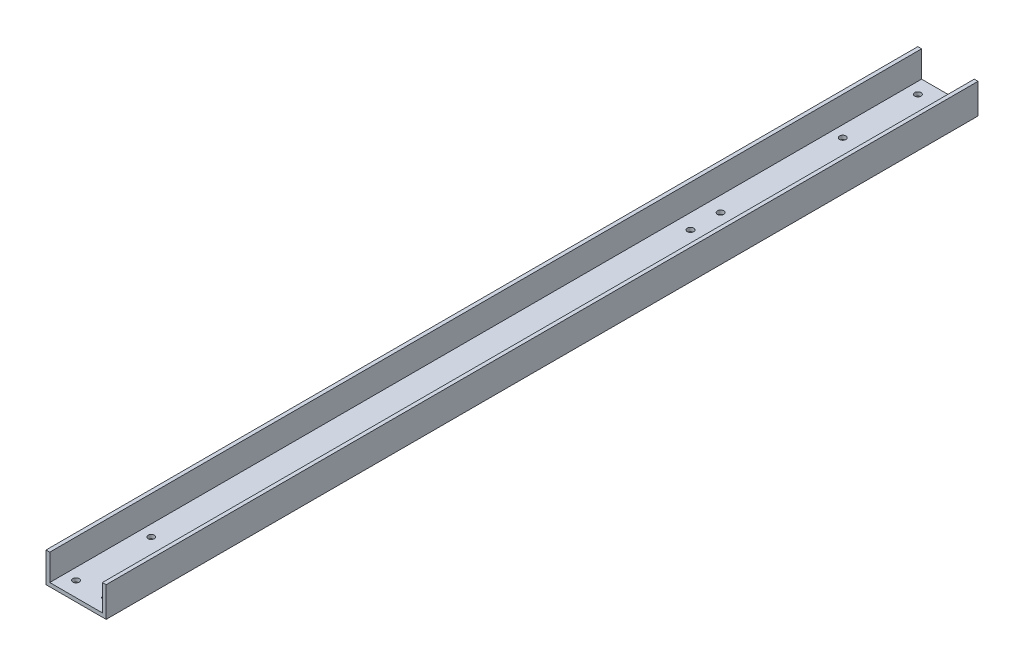
ISO-10303-21;
HEADER;
FILE_DESCRIPTION(('STEP AP214'),'2;1');
FILE_NAME('part.step','',(''),(''),'','','');
FILE_SCHEMA(('AUTOMOTIVE_DESIGN { 1 0 10303 214 1 1 1 1 }'));
ENDSEC;
DATA;
#1=APPLICATION_CONTEXT('core data for automotive mechanical design processes');
#2=APPLICATION_PROTOCOL_DEFINITION('international standard','automotive_design',2000,#1);
#3=PRODUCT_CONTEXT('',#1,'mechanical');
#4=PRODUCT('Part','Part','',(#3));
#5=PRODUCT_RELATED_PRODUCT_CATEGORY('part','',(#4));
#6=PRODUCT_DEFINITION_FORMATION('','',#4);
#7=PRODUCT_DEFINITION_CONTEXT('part definition',#1,'design');
#8=PRODUCT_DEFINITION('design','',#6,#7);
#9=PRODUCT_DEFINITION_SHAPE('','',#8);
#10=(LENGTH_UNIT() NAMED_UNIT(*) SI_UNIT(.MILLI.,.METRE.));
#11=(NAMED_UNIT(*) PLANE_ANGLE_UNIT() SI_UNIT($,.RADIAN.));
#12=(NAMED_UNIT(*) SI_UNIT($,.STERADIAN.) SOLID_ANGLE_UNIT());
#13=UNCERTAINTY_MEASURE_WITH_UNIT(LENGTH_MEASURE(1.E-05),#10,'distance_accuracy_value','');
#14=(GEOMETRIC_REPRESENTATION_CONTEXT(3) GLOBAL_UNCERTAINTY_ASSIGNED_CONTEXT((#13)) GLOBAL_UNIT_ASSIGNED_CONTEXT((#10,
#11,#12)) REPRESENTATION_CONTEXT('',''));
#15=CARTESIAN_POINT('',(0.,0.,0.));
#16=DIRECTION('',(0.,0.,1.));
#17=DIRECTION('',(1.,0.,0.));
#18=AXIS2_PLACEMENT_3D('',#15,#16,#17);
#19=CARTESIAN_POINT('',(0.,0.,736.6));
#20=DIRECTION('',(1.,0.,0.));
#21=DIRECTION('',(0.,0.,-1.));
#22=AXIS2_PLACEMENT_3D('',#19,#20,#21);
#23=PLANE('',#22);
#24=DIRECTION('',(0.,-1.,0.));
#25=VECTOR('',#24,1.);
#26=CARTESIAN_POINT('',(0.,0.,0.));
#27=LINE('',#26,#25);
#28=CARTESIAN_POINT('',(0.,25.4,0.));
#29=VERTEX_POINT('',#28);
#30=CARTESIAN_POINT('',(0.,0.,0.));
#31=VERTEX_POINT('',#30);
#32=EDGE_CURVE('E136',#29,#31,#27,.T.);
#33=ORIENTED_EDGE('',*,*,#32,.T.);
#34=DIRECTION('',(0.,0.,-1.));
#35=VECTOR('',#34,1.);
#36=CARTESIAN_POINT('',(0.,0.,736.6));
#37=LINE('',#36,#35);
#38=CARTESIAN_POINT('',(0.,0.,736.6));
#39=VERTEX_POINT('',#38);
#40=EDGE_CURVE('E11',#39,#31,#37,.T.);
#41=ORIENTED_EDGE('',*,*,#40,.F.);
#42=DIRECTION('',(0.,-1.,0.));
#43=VECTOR('',#42,1.);
#44=CARTESIAN_POINT('',(0.,0.,736.6));
#45=LINE('',#44,#43);
#46=CARTESIAN_POINT('',(0.,25.4,736.6));
#47=VERTEX_POINT('',#46);
#48=EDGE_CURVE('E151',#47,#39,#45,.T.);
#49=ORIENTED_EDGE('',*,*,#48,.F.);
#50=DIRECTION('',(0.,0.,-1.));
#51=VECTOR('',#50,1.);
#52=CARTESIAN_POINT('',(0.,25.4,736.6));
#53=LINE('',#52,#51);
#54=EDGE_CURVE('E132',#47,#29,#53,.T.);
#55=ORIENTED_EDGE('',*,*,#54,.T.);
#56=EDGE_LOOP('',(#33,#41,#49,#55));
#57=FACE_BOUND('',#56,.T.);
#58=ADVANCED_FACE('F38',(#57),#23,.F.);
#59=CARTESIAN_POINT('',(0.,0.,736.6));
#60=DIRECTION('',(0.,1.,0.));
#61=DIRECTION('',(0.,0.,1.));
#62=AXIS2_PLACEMENT_3D('',#59,#60,#61);
#63=PLANE('',#62);
#64=CARTESIAN_POINT('',(15.8750000000001,0.,207.937100000006));
#65=DIRECTION('',(0.,1.,0.));
#66=DIRECTION('',(0.,0.,1.));
#67=AXIS2_PLACEMENT_3D('',#64,#65,#66);
#68=CIRCLE('',#67,2.667);
#69=CARTESIAN_POINT('',(15.8750000000001,0.,210.604100000006));
#70=VERTEX_POINT('',#69);
#71=EDGE_CURVE('E241',#70,#70,#68,.F.);
#72=ORIENTED_EDGE('',*,*,#71,.F.);
#73=EDGE_LOOP('',(#72));
#74=FACE_BOUND('',#73,.T.);
#75=CARTESIAN_POINT('',(34.9250000000001,0.,182.537100000006));
#76=DIRECTION('',(0.,1.,0.));
#77=DIRECTION('',(0.,0.,1.));
#78=AXIS2_PLACEMENT_3D('',#75,#76,#77);
#79=CIRCLE('',#78,2.667);
#80=CARTESIAN_POINT('',(34.9250000000001,0.,185.204100000006));
#81=VERTEX_POINT('',#80);
#82=EDGE_CURVE('E251',#81,#81,#79,.F.);
#83=ORIENTED_EDGE('',*,*,#82,.F.);
#84=EDGE_LOOP('',(#83));
#85=FACE_BOUND('',#84,.T.);
#86=CARTESIAN_POINT('',(15.8750000000001,0.,182.537100000006));
#87=DIRECTION('',(0.,1.,0.));
#88=DIRECTION('',(0.,0.,1.));
#89=AXIS2_PLACEMENT_3D('',#86,#87,#88);
#90=CIRCLE('',#89,2.667);
#91=CARTESIAN_POINT('',(15.8750000000001,0.,185.204100000006));
#92=VERTEX_POINT('',#91);
#93=EDGE_CURVE('E242',#92,#92,#90,.F.);
#94=ORIENTED_EDGE('',*,*,#93,.F.);
#95=EDGE_LOOP('',(#94));
#96=FACE_BOUND('',#95,.T.);
#97=CARTESIAN_POINT('',(34.9250000000001,0.,207.937100000006));
#98=DIRECTION('',(0.,1.,0.));
#99=DIRECTION('',(0.,0.,1.));
#100=AXIS2_PLACEMENT_3D('',#97,#98,#99);
#101=CIRCLE('',#100,2.667);
#102=CARTESIAN_POINT('',(34.9250000000001,0.,210.604100000006));
#103=VERTEX_POINT('',#102);
#104=EDGE_CURVE('E201',#103,#103,#101,.F.);
#105=ORIENTED_EDGE('',*,*,#104,.F.);
#106=EDGE_LOOP('',(#105));
#107=FACE_BOUND('',#106,.T.);
#108=CARTESIAN_POINT('',(12.7,0.,660.4));
#109=DIRECTION('',(0.,1.,0.));
#110=DIRECTION('',(0.,0.,1.));
#111=AXIS2_PLACEMENT_3D('',#108,#109,#110);
#112=CIRCLE('',#111,2.667);
#113=CARTESIAN_POINT('',(12.7,0.,663.067));
#114=VERTEX_POINT('',#113);
#115=EDGE_CURVE('E193',#114,#114,#112,.F.);
#116=ORIENTED_EDGE('',*,*,#115,.F.);
#117=EDGE_LOOP('',(#116));
#118=FACE_BOUND('',#117,.T.);
#119=CARTESIAN_POINT('',(38.1,0.,660.4));
#120=DIRECTION('',(0.,1.,0.));
#121=DIRECTION('',(0.,0.,1.));
#122=AXIS2_PLACEMENT_3D('',#119,#120,#121);
#123=CIRCLE('',#122,2.667);
#124=CARTESIAN_POINT('',(38.1,0.,663.067));
#125=VERTEX_POINT('',#124);
#126=EDGE_CURVE('E226',#125,#125,#123,.F.);
#127=ORIENTED_EDGE('',*,*,#126,.F.);
#128=EDGE_LOOP('',(#127));
#129=FACE_BOUND('',#128,.T.);
#130=CARTESIAN_POINT('',(38.1,0.,723.9));
#131=DIRECTION('',(0.,1.,0.));
#132=DIRECTION('',(0.,0.,1.));
#133=AXIS2_PLACEMENT_3D('',#130,#131,#132);
#134=CIRCLE('',#133,2.667);
#135=CARTESIAN_POINT('',(38.1,0.,726.567));
#136=VERTEX_POINT('',#135);
#137=EDGE_CURVE('E220',#136,#136,#134,.F.);
#138=ORIENTED_EDGE('',*,*,#137,.F.);
#139=EDGE_LOOP('',(#138));
#140=FACE_BOUND('',#139,.T.);
#141=CARTESIAN_POINT('',(38.1,0.,12.7));
#142=DIRECTION('',(0.,1.,0.));
#143=DIRECTION('',(0.,0.,1.));
#144=AXIS2_PLACEMENT_3D('',#141,#142,#143);
#145=CIRCLE('',#144,2.667);
#146=CARTESIAN_POINT('',(38.1,0.,15.367));
#147=VERTEX_POINT('',#146);
#148=EDGE_CURVE('E214',#147,#147,#145,.F.);
#149=ORIENTED_EDGE('',*,*,#148,.F.);
#150=EDGE_LOOP('',(#149));
#151=FACE_BOUND('',#150,.T.);
#152=CARTESIAN_POINT('',(38.1,0.,76.2));
#153=DIRECTION('',(0.,1.,0.));
#154=DIRECTION('',(0.,0.,1.));
#155=AXIS2_PLACEMENT_3D('',#152,#153,#154);
#156=CIRCLE('',#155,2.667);
#157=CARTESIAN_POINT('',(38.1,0.,78.867));
#158=VERTEX_POINT('',#157);
#159=EDGE_CURVE('E208',#158,#158,#156,.F.);
#160=ORIENTED_EDGE('',*,*,#159,.F.);
#161=EDGE_LOOP('',(#160));
#162=FACE_BOUND('',#161,.T.);
#163=CARTESIAN_POINT('',(12.7,0.,12.7));
#164=DIRECTION('',(0.,1.,0.));
#165=DIRECTION('',(0.,0.,1.));
#166=AXIS2_PLACEMENT_3D('',#163,#164,#165);
#167=CIRCLE('',#166,2.667);
#168=CARTESIAN_POINT('',(12.7,0.,15.367));
#169=VERTEX_POINT('',#168);
#170=EDGE_CURVE('E202',#169,#169,#167,.F.);
#171=ORIENTED_EDGE('',*,*,#170,.F.);
#172=EDGE_LOOP('',(#171));
#173=FACE_BOUND('',#172,.T.);
#174=CARTESIAN_POINT('',(12.7,0.,76.2));
#175=DIRECTION('',(0.,1.,0.));
#176=DIRECTION('',(0.,0.,1.));
#177=AXIS2_PLACEMENT_3D('',#174,#175,#176);
#178=CIRCLE('',#177,2.667);
#179=CARTESIAN_POINT('',(12.7,0.,78.867));
#180=VERTEX_POINT('',#179);
#181=EDGE_CURVE('E194',#180,#180,#178,.F.);
#182=ORIENTED_EDGE('',*,*,#181,.F.);
#183=EDGE_LOOP('',(#182));
#184=FACE_BOUND('',#183,.T.);
#185=CARTESIAN_POINT('',(12.7,0.,723.9));
#186=DIRECTION('',(0.,1.,0.));
#187=DIRECTION('',(0.,0.,1.));
#188=AXIS2_PLACEMENT_3D('',#185,#186,#187);
#189=CIRCLE('',#188,2.667);
#190=CARTESIAN_POINT('',(12.7,0.,726.567));
#191=VERTEX_POINT('',#190);
#192=EDGE_CURVE('E140',#191,#191,#189,.F.);
#193=ORIENTED_EDGE('',*,*,#192,.F.);
#194=EDGE_LOOP('',(#193));
#195=FACE_BOUND('',#194,.T.);
#196=DIRECTION('',(1.,0.,0.));
#197=VECTOR('',#196,1.);
#198=CARTESIAN_POINT('',(0.,0.,0.));
#199=LINE('',#198,#197);
#200=CARTESIAN_POINT('',(50.8,0.,0.));
#201=VERTEX_POINT('',#200);
#202=EDGE_CURVE('E139',#31,#201,#199,.T.);
#203=ORIENTED_EDGE('',*,*,#202,.T.);
#204=DIRECTION('',(0.,0.,-1.));
#205=VECTOR('',#204,1.);
#206=CARTESIAN_POINT('',(50.8,0.,736.6));
#207=LINE('',#206,#205);
#208=CARTESIAN_POINT('',(50.8,0.,736.6));
#209=VERTEX_POINT('',#208);
#210=EDGE_CURVE('E47',#209,#201,#207,.T.);
#211=ORIENTED_EDGE('',*,*,#210,.F.);
#212=DIRECTION('',(1.,0.,0.));
#213=VECTOR('',#212,1.);
#214=CARTESIAN_POINT('',(0.,0.,736.6));
#215=LINE('',#214,#213);
#216=EDGE_CURVE('E98',#39,#209,#215,.T.);
#217=ORIENTED_EDGE('',*,*,#216,.F.);
#218=ORIENTED_EDGE('',*,*,#40,.T.);
#219=EDGE_LOOP('',(#203,#211,#217,#218));
#220=FACE_BOUND('',#219,.T.);
#221=ADVANCED_FACE('F299',(#74,#85,#96,#107,#118,#129,#140,#151,#162,#173,#184,#195,#220),#63,.F.);
#222=CARTESIAN_POINT('',(50.8,0.,736.6));
#223=DIRECTION('',(-1.,0.,0.));
#224=DIRECTION('',(0.,0.,1.));
#225=AXIS2_PLACEMENT_3D('',#222,#223,#224);
#226=PLANE('',#225);
#227=DIRECTION('',(0.,1.,0.));
#228=VECTOR('',#227,1.);
#229=CARTESIAN_POINT('',(50.8,0.,0.));
#230=LINE('',#229,#228);
#231=CARTESIAN_POINT('',(50.8,25.4,0.));
#232=VERTEX_POINT('',#231);
#233=EDGE_CURVE('E142',#201,#232,#230,.T.);
#234=ORIENTED_EDGE('',*,*,#233,.T.);
#235=DIRECTION('',(0.,0.,-1.));
#236=VECTOR('',#235,1.);
#237=CARTESIAN_POINT('',(50.8,25.4,736.6));
#238=LINE('',#237,#236);
#239=CARTESIAN_POINT('',(50.8,25.4,736.6));
#240=VERTEX_POINT('',#239);
#241=EDGE_CURVE('E161',#240,#232,#238,.T.);
#242=ORIENTED_EDGE('',*,*,#241,.F.);
#243=DIRECTION('',(0.,1.,0.));
#244=VECTOR('',#243,1.);
#245=CARTESIAN_POINT('',(50.8,0.,736.6));
#246=LINE('',#245,#244);
#247=EDGE_CURVE('E170',#209,#240,#246,.T.);
#248=ORIENTED_EDGE('',*,*,#247,.F.);
#249=ORIENTED_EDGE('',*,*,#210,.T.);
#250=EDGE_LOOP('',(#234,#242,#248,#249));
#251=FACE_BOUND('',#250,.T.);
#252=ADVANCED_FACE('F168',(#251),#226,.F.);
#253=CARTESIAN_POINT('',(47.625,25.4,736.6));
#254=DIRECTION('',(0.,-1.,0.));
#255=DIRECTION('',(0.,0.,-1.));
#256=AXIS2_PLACEMENT_3D('',#253,#254,#255);
#257=PLANE('',#256);
#258=DIRECTION('',(-1.,0.,0.));
#259=VECTOR('',#258,1.);
#260=CARTESIAN_POINT('',(47.625,25.4,0.));
#261=LINE('',#260,#259);
#262=CARTESIAN_POINT('',(47.625,25.4,0.));
#263=VERTEX_POINT('',#262);
#264=EDGE_CURVE('E144',#232,#263,#261,.T.);
#265=ORIENTED_EDGE('',*,*,#264,.T.);
#266=DIRECTION('',(0.,0.,-1.));
#267=VECTOR('',#266,1.);
#268=CARTESIAN_POINT('',(47.625,25.4,736.6));
#269=LINE('',#268,#267);
#270=CARTESIAN_POINT('',(47.625,25.4,736.6));
#271=VERTEX_POINT('',#270);
#272=EDGE_CURVE('E157',#271,#263,#269,.T.);
#273=ORIENTED_EDGE('',*,*,#272,.F.);
#274=DIRECTION('',(-1.,0.,0.));
#275=VECTOR('',#274,1.);
#276=CARTESIAN_POINT('',(47.625,25.4,736.6));
#277=LINE('',#276,#275);
#278=EDGE_CURVE('E182',#240,#271,#277,.T.);
#279=ORIENTED_EDGE('',*,*,#278,.F.);
#280=ORIENTED_EDGE('',*,*,#241,.T.);
#281=EDGE_LOOP('',(#265,#273,#279,#280));
#282=FACE_BOUND('',#281,.T.);
#283=ADVANCED_FACE('F178',(#282),#257,.F.);
#284=CARTESIAN_POINT('',(47.625,3.175,736.6));
#285=DIRECTION('',(1.,0.,0.));
#286=DIRECTION('',(0.,0.,-1.));
#287=AXIS2_PLACEMENT_3D('',#284,#285,#286);
#288=PLANE('',#287);
#289=DIRECTION('',(0.,-1.,0.));
#290=VECTOR('',#289,1.);
#291=CARTESIAN_POINT('',(47.625,3.175,0.));
#292=LINE('',#291,#290);
#293=CARTESIAN_POINT('',(47.625,3.175,0.));
#294=VERTEX_POINT('',#293);
#295=EDGE_CURVE('E146',#263,#294,#292,.T.);
#296=ORIENTED_EDGE('',*,*,#295,.T.);
#297=DIRECTION('',(0.,0.,-1.));
#298=VECTOR('',#297,1.);
#299=CARTESIAN_POINT('',(47.625,3.175,736.6));
#300=LINE('',#299,#298);
#301=CARTESIAN_POINT('',(47.625,3.175,736.6));
#302=VERTEX_POINT('',#301);
#303=EDGE_CURVE('E127',#302,#294,#300,.T.);
#304=ORIENTED_EDGE('',*,*,#303,.F.);
#305=DIRECTION('',(0.,-1.,0.));
#306=VECTOR('',#305,1.);
#307=CARTESIAN_POINT('',(47.625,3.175,736.6));
#308=LINE('',#307,#306);
#309=EDGE_CURVE('E117',#271,#302,#308,.T.);
#310=ORIENTED_EDGE('',*,*,#309,.F.);
#311=ORIENTED_EDGE('',*,*,#272,.T.);
#312=EDGE_LOOP('',(#296,#304,#310,#311));
#313=FACE_BOUND('',#312,.T.);
#314=ADVANCED_FACE('F181',(#313),#288,.F.);
#315=CARTESIAN_POINT('',(3.175,3.175,736.6));
#316=DIRECTION('',(0.,-1.,0.));
#317=DIRECTION('',(0.,0.,-1.));
#318=AXIS2_PLACEMENT_3D('',#315,#316,#317);
#319=PLANE('',#318);
#320=CARTESIAN_POINT('',(15.8750000000001,3.175,207.937100000006));
#321=DIRECTION('',(0.,1.,0.));
#322=DIRECTION('',(0.,0.,1.));
#323=AXIS2_PLACEMENT_3D('',#320,#321,#322);
#324=CIRCLE('',#323,2.667);
#325=CARTESIAN_POINT('',(15.8750000000001,3.175,210.604100000006));
#326=VERTEX_POINT('',#325);
#327=EDGE_CURVE('E254',#326,#326,#324,.T.);
#328=ORIENTED_EDGE('',*,*,#327,.F.);
#329=EDGE_LOOP('',(#328));
#330=FACE_BOUND('',#329,.T.);
#331=CARTESIAN_POINT('',(34.9250000000001,3.175,182.537100000006));
#332=DIRECTION('',(0.,1.,0.));
#333=DIRECTION('',(0.,0.,1.));
#334=AXIS2_PLACEMENT_3D('',#331,#332,#333);
#335=CIRCLE('',#334,2.667);
#336=CARTESIAN_POINT('',(34.9250000000001,3.175,185.204100000006));
#337=VERTEX_POINT('',#336);
#338=EDGE_CURVE('E246',#337,#337,#335,.T.);
#339=ORIENTED_EDGE('',*,*,#338,.F.);
#340=EDGE_LOOP('',(#339));
#341=FACE_BOUND('',#340,.T.);
#342=CARTESIAN_POINT('',(15.8750000000001,3.175,182.537100000006));
#343=DIRECTION('',(0.,1.,0.));
#344=DIRECTION('',(0.,0.,1.));
#345=AXIS2_PLACEMENT_3D('',#342,#343,#344);
#346=CIRCLE('',#345,2.667);
#347=CARTESIAN_POINT('',(15.8750000000001,3.175,185.204100000006));
#348=VERTEX_POINT('',#347);
#349=EDGE_CURVE('E247',#348,#348,#346,.T.);
#350=ORIENTED_EDGE('',*,*,#349,.F.);
#351=EDGE_LOOP('',(#350));
#352=FACE_BOUND('',#351,.T.);
#353=CARTESIAN_POINT('',(34.9250000000001,3.175,207.937100000006));
#354=DIRECTION('',(0.,1.,0.));
#355=DIRECTION('',(0.,0.,1.));
#356=AXIS2_PLACEMENT_3D('',#353,#354,#355);
#357=CIRCLE('',#356,2.667);
#358=CARTESIAN_POINT('',(34.9250000000001,3.175,210.604100000006));
#359=VERTEX_POINT('',#358);
#360=EDGE_CURVE('E238',#359,#359,#357,.T.);
#361=ORIENTED_EDGE('',*,*,#360,.F.);
#362=EDGE_LOOP('',(#361));
#363=FACE_BOUND('',#362,.T.);
#364=CARTESIAN_POINT('',(12.7,3.175,660.4));
#365=DIRECTION('',(0.,1.,0.));
#366=DIRECTION('',(0.,0.,1.));
#367=AXIS2_PLACEMENT_3D('',#364,#365,#366);
#368=CIRCLE('',#367,2.667);
#369=CARTESIAN_POINT('',(12.7,3.175,663.067));
#370=VERTEX_POINT('',#369);
#371=EDGE_CURVE('E229',#370,#370,#368,.T.);
#372=ORIENTED_EDGE('',*,*,#371,.F.);
#373=EDGE_LOOP('',(#372));
#374=FACE_BOUND('',#373,.T.);
#375=CARTESIAN_POINT('',(38.1,3.175,660.4));
#376=DIRECTION('',(0.,1.,0.));
#377=DIRECTION('',(0.,0.,1.));
#378=AXIS2_PLACEMENT_3D('',#375,#376,#377);
#379=CIRCLE('',#378,2.667);
#380=CARTESIAN_POINT('',(38.1,3.175,663.067));
#381=VERTEX_POINT('',#380);
#382=EDGE_CURVE('E223',#381,#381,#379,.T.);
#383=ORIENTED_EDGE('',*,*,#382,.F.);
#384=EDGE_LOOP('',(#383));
#385=FACE_BOUND('',#384,.T.);
#386=CARTESIAN_POINT('',(38.1,3.175,723.9));
#387=DIRECTION('',(0.,1.,0.));
#388=DIRECTION('',(0.,0.,1.));
#389=AXIS2_PLACEMENT_3D('',#386,#387,#388);
#390=CIRCLE('',#389,2.667);
#391=CARTESIAN_POINT('',(38.1,3.175,726.567));
#392=VERTEX_POINT('',#391);
#393=EDGE_CURVE('E217',#392,#392,#390,.T.);
#394=ORIENTED_EDGE('',*,*,#393,.F.);
#395=EDGE_LOOP('',(#394));
#396=FACE_BOUND('',#395,.T.);
#397=CARTESIAN_POINT('',(38.1,3.175,12.7));
#398=DIRECTION('',(0.,1.,0.));
#399=DIRECTION('',(0.,0.,-1.));
#400=AXIS2_PLACEMENT_3D('',#397,#398,#399);
#401=CIRCLE('',#400,2.667);
#402=CARTESIAN_POINT('',(38.1,3.175,10.033));
#403=VERTEX_POINT('',#402);
#404=EDGE_CURVE('E211',#403,#403,#401,.T.);
#405=ORIENTED_EDGE('',*,*,#404,.F.);
#406=EDGE_LOOP('',(#405));
#407=FACE_BOUND('',#406,.T.);
#408=CARTESIAN_POINT('',(38.1,3.175,76.2));
#409=DIRECTION('',(0.,1.,0.));
#410=DIRECTION('',(0.,0.,-1.));
#411=AXIS2_PLACEMENT_3D('',#408,#409,#410);
#412=CIRCLE('',#411,2.667);
#413=CARTESIAN_POINT('',(38.1,3.175,73.533));
#414=VERTEX_POINT('',#413);
#415=EDGE_CURVE('E205',#414,#414,#412,.T.);
#416=ORIENTED_EDGE('',*,*,#415,.F.);
#417=EDGE_LOOP('',(#416));
#418=FACE_BOUND('',#417,.T.);
#419=CARTESIAN_POINT('',(12.7,3.175,12.7));
#420=DIRECTION('',(0.,1.,0.));
#421=DIRECTION('',(0.,0.,-1.));
#422=AXIS2_PLACEMENT_3D('',#419,#420,#421);
#423=CIRCLE('',#422,2.667);
#424=CARTESIAN_POINT('',(12.7,3.175,10.033));
#425=VERTEX_POINT('',#424);
#426=EDGE_CURVE('E197',#425,#425,#423,.T.);
#427=ORIENTED_EDGE('',*,*,#426,.F.);
#428=EDGE_LOOP('',(#427));
#429=FACE_BOUND('',#428,.T.);
#430=CARTESIAN_POINT('',(12.7,3.175,76.2));
#431=DIRECTION('',(0.,1.,0.));
#432=DIRECTION('',(0.,0.,-1.));
#433=AXIS2_PLACEMENT_3D('',#430,#431,#432);
#434=CIRCLE('',#433,2.667);
#435=CARTESIAN_POINT('',(12.7,3.175,73.533));
#436=VERTEX_POINT('',#435);
#437=EDGE_CURVE('E198',#436,#436,#434,.T.);
#438=ORIENTED_EDGE('',*,*,#437,.F.);
#439=EDGE_LOOP('',(#438));
#440=FACE_BOUND('',#439,.T.);
#441=CARTESIAN_POINT('',(12.7,3.175,723.9));
#442=DIRECTION('',(0.,1.,0.));
#443=DIRECTION('',(0.,0.,1.));
#444=AXIS2_PLACEMENT_3D('',#441,#442,#443);
#445=CIRCLE('',#444,2.667);
#446=CARTESIAN_POINT('',(12.7,3.175,726.567));
#447=VERTEX_POINT('',#446);
#448=EDGE_CURVE('E190',#447,#447,#445,.T.);
#449=ORIENTED_EDGE('',*,*,#448,.F.);
#450=EDGE_LOOP('',(#449));
#451=FACE_BOUND('',#450,.T.);
#452=DIRECTION('',(-1.,0.,0.));
#453=VECTOR('',#452,1.);
#454=CARTESIAN_POINT('',(3.175,3.175,0.));
#455=LINE('',#454,#453);
#456=CARTESIAN_POINT('',(3.175,3.175,0.));
#457=VERTEX_POINT('',#456);
#458=EDGE_CURVE('E125',#294,#457,#455,.T.);
#459=ORIENTED_EDGE('',*,*,#458,.T.);
#460=DIRECTION('',(0.,0.,-1.));
#461=VECTOR('',#460,1.);
#462=CARTESIAN_POINT('',(3.175,3.175,736.6));
#463=LINE('',#462,#461);
#464=CARTESIAN_POINT('',(3.175,3.175,736.6));
#465=VERTEX_POINT('',#464);
#466=EDGE_CURVE('E122',#465,#457,#463,.T.);
#467=ORIENTED_EDGE('',*,*,#466,.F.);
#468=DIRECTION('',(-1.,0.,0.));
#469=VECTOR('',#468,1.);
#470=CARTESIAN_POINT('',(3.175,3.175,736.6));
#471=LINE('',#470,#469);
#472=EDGE_CURVE('E111',#302,#465,#471,.T.);
#473=ORIENTED_EDGE('',*,*,#472,.F.);
#474=ORIENTED_EDGE('',*,*,#303,.T.);
#475=EDGE_LOOP('',(#459,#467,#473,#474));
#476=FACE_BOUND('',#475,.T.);
#477=ADVANCED_FACE('F123',(#330,#341,#352,#363,#374,#385,#396,#407,#418,#429,#440,#451,#476),
#319,.F.);
#478=CARTESIAN_POINT('',(3.175,3.175,736.6));
#479=DIRECTION('',(-1.,0.,0.));
#480=DIRECTION('',(0.,0.,1.));
#481=AXIS2_PLACEMENT_3D('',#478,#479,#480);
#482=PLANE('',#481);
#483=DIRECTION('',(0.,1.,0.));
#484=VECTOR('',#483,1.);
#485=CARTESIAN_POINT('',(3.175,3.175,0.));
#486=LINE('',#485,#484);
#487=CARTESIAN_POINT('',(3.175,25.4,0.));
#488=VERTEX_POINT('',#487);
#489=EDGE_CURVE('E84',#457,#488,#486,.T.);
#490=ORIENTED_EDGE('',*,*,#489,.T.);
#491=DIRECTION('',(0.,0.,-1.));
#492=VECTOR('',#491,1.);
#493=CARTESIAN_POINT('',(3.175,25.4,736.6));
#494=LINE('',#493,#492);
#495=CARTESIAN_POINT('',(3.175,25.4,736.6));
#496=VERTEX_POINT('',#495);
#497=EDGE_CURVE('E128',#496,#488,#494,.T.);
#498=ORIENTED_EDGE('',*,*,#497,.F.);
#499=DIRECTION('',(0.,1.,0.));
#500=VECTOR('',#499,1.);
#501=CARTESIAN_POINT('',(3.175,3.175,736.6));
#502=LINE('',#501,#500);
#503=EDGE_CURVE('E115',#465,#496,#502,.T.);
#504=ORIENTED_EDGE('',*,*,#503,.F.);
#505=ORIENTED_EDGE('',*,*,#466,.T.);
#506=EDGE_LOOP('',(#490,#498,#504,#505));
#507=FACE_BOUND('',#506,.T.);
#508=ADVANCED_FACE('F130',(#507),#482,.F.);
#509=CARTESIAN_POINT('',(0.,25.4,736.6));
#510=DIRECTION('',(0.,-1.,0.));
#511=DIRECTION('',(0.,0.,-1.));
#512=AXIS2_PLACEMENT_3D('',#509,#510,#511);
#513=PLANE('',#512);
#514=DIRECTION('',(-1.,0.,0.));
#515=VECTOR('',#514,1.);
#516=CARTESIAN_POINT('',(0.,25.4,0.));
#517=LINE('',#516,#515);
#518=EDGE_CURVE('E90',#488,#29,#517,.T.);
#519=ORIENTED_EDGE('',*,*,#518,.T.);
#520=ORIENTED_EDGE('',*,*,#54,.F.);
#521=DIRECTION('',(-1.,0.,0.));
#522=VECTOR('',#521,1.);
#523=CARTESIAN_POINT('',(0.,25.4,736.6));
#524=LINE('',#523,#522);
#525=EDGE_CURVE('E55',#496,#47,#524,.T.);
#526=ORIENTED_EDGE('',*,*,#525,.F.);
#527=ORIENTED_EDGE('',*,*,#497,.T.);
#528=EDGE_LOOP('',(#519,#520,#526,#527));
#529=FACE_BOUND('',#528,.T.);
#530=ADVANCED_FACE('F305',(#529),#513,.F.);
#531=CARTESIAN_POINT('',(0.,0.,736.6));
#532=DIRECTION('',(0.,0.,-1.));
#533=DIRECTION('',(-1.,0.,0.));
#534=AXIS2_PLACEMENT_3D('',#531,#532,#533);
#535=PLANE('',#534);
#536=ORIENTED_EDGE('',*,*,#48,.T.);
#537=ORIENTED_EDGE('',*,*,#216,.T.);
#538=ORIENTED_EDGE('',*,*,#247,.T.);
#539=ORIENTED_EDGE('',*,*,#278,.T.);
#540=ORIENTED_EDGE('',*,*,#309,.T.);
#541=ORIENTED_EDGE('',*,*,#472,.T.);
#542=ORIENTED_EDGE('',*,*,#503,.T.);
#543=ORIENTED_EDGE('',*,*,#525,.T.);
#544=EDGE_LOOP('',(#536,#537,#538,#539,#540,#541,#542,#543));
#545=FACE_BOUND('',#544,.T.);
#546=ADVANCED_FACE('F113',(#545),#535,.F.);
#547=CARTESIAN_POINT('',(0.,0.,0.));
#548=DIRECTION('',(0.,0.,-1.));
#549=DIRECTION('',(-1.,0.,0.));
#550=AXIS2_PLACEMENT_3D('',#547,#548,#549);
#551=PLANE('',#550);
#552=ORIENTED_EDGE('',*,*,#32,.F.);
#553=ORIENTED_EDGE('',*,*,#518,.F.);
#554=ORIENTED_EDGE('',*,*,#489,.F.);
#555=ORIENTED_EDGE('',*,*,#458,.F.);
#556=ORIENTED_EDGE('',*,*,#295,.F.);
#557=ORIENTED_EDGE('',*,*,#264,.F.);
#558=ORIENTED_EDGE('',*,*,#233,.F.);
#559=ORIENTED_EDGE('',*,*,#202,.F.);
#560=EDGE_LOOP('',(#552,#553,#554,#555,#556,#557,#558,#559));
#561=FACE_BOUND('',#560,.T.);
#562=ADVANCED_FACE('F174',(#561),#551,.T.);
#563=CARTESIAN_POINT('',(12.7,-0.00100000000000013,723.9));
#564=DIRECTION('',(0.,1.,0.));
#565=DIRECTION('',(0.,0.,1.));
#566=AXIS2_PLACEMENT_3D('',#563,#564,#565);
#567=CYLINDRICAL_SURFACE('',#566,2.667);
#568=ORIENTED_EDGE('',*,*,#448,.T.);
#569=EDGE_LOOP('',(#568));
#570=FACE_BOUND('',#569,.T.);
#571=ORIENTED_EDGE('',*,*,#192,.T.);
#572=EDGE_LOOP('',(#571));
#573=FACE_BOUND('',#572,.T.);
#574=ADVANCED_FACE('F292',(#570,#573),#567,.F.);
#575=CARTESIAN_POINT('',(12.7,-0.00100000000000013,76.2));
#576=DIRECTION('',(0.,1.,0.));
#577=DIRECTION('',(0.,0.,1.));
#578=AXIS2_PLACEMENT_3D('',#575,#576,#577);
#579=CYLINDRICAL_SURFACE('',#578,2.667);
#580=ORIENTED_EDGE('',*,*,#437,.T.);
#581=EDGE_LOOP('',(#580));
#582=FACE_BOUND('',#581,.T.);
#583=ORIENTED_EDGE('',*,*,#181,.T.);
#584=EDGE_LOOP('',(#583));
#585=FACE_BOUND('',#584,.T.);
#586=ADVANCED_FACE('F295',(#582,#585),#579,.F.);
#587=CARTESIAN_POINT('',(12.7,-0.00100000000000013,12.7));
#588=DIRECTION('',(0.,1.,0.));
#589=DIRECTION('',(0.,0.,1.));
#590=AXIS2_PLACEMENT_3D('',#587,#588,#589);
#591=CYLINDRICAL_SURFACE('',#590,2.667);
#592=ORIENTED_EDGE('',*,*,#426,.T.);
#593=EDGE_LOOP('',(#592));
#594=FACE_BOUND('',#593,.T.);
#595=ORIENTED_EDGE('',*,*,#170,.T.);
#596=EDGE_LOOP('',(#595));
#597=FACE_BOUND('',#596,.T.);
#598=ADVANCED_FACE('F382',(#594,#597),#591,.F.);
#599=CARTESIAN_POINT('',(38.1,-0.00100000000000013,76.2));
#600=DIRECTION('',(0.,1.,0.));
#601=DIRECTION('',(0.,0.,1.));
#602=AXIS2_PLACEMENT_3D('',#599,#600,#601);
#603=CYLINDRICAL_SURFACE('',#602,2.667);
#604=ORIENTED_EDGE('',*,*,#415,.T.);
#605=EDGE_LOOP('',(#604));
#606=FACE_BOUND('',#605,.T.);
#607=ORIENTED_EDGE('',*,*,#159,.T.);
#608=EDGE_LOOP('',(#607));
#609=FACE_BOUND('',#608,.T.);
#610=ADVANCED_FACE('F392',(#606,#609),#603,.F.);
#611=CARTESIAN_POINT('',(38.1,-0.00100000000000013,12.7));
#612=DIRECTION('',(0.,1.,0.));
#613=DIRECTION('',(0.,0.,1.));
#614=AXIS2_PLACEMENT_3D('',#611,#612,#613);
#615=CYLINDRICAL_SURFACE('',#614,2.667);
#616=ORIENTED_EDGE('',*,*,#404,.T.);
#617=EDGE_LOOP('',(#616));
#618=FACE_BOUND('',#617,.T.);
#619=ORIENTED_EDGE('',*,*,#148,.T.);
#620=EDGE_LOOP('',(#619));
#621=FACE_BOUND('',#620,.T.);
#622=ADVANCED_FACE('F402',(#618,#621),#615,.F.);
#623=CARTESIAN_POINT('',(38.1,-0.00100000000000013,723.9));
#624=DIRECTION('',(0.,1.,0.));
#625=DIRECTION('',(0.,0.,1.));
#626=AXIS2_PLACEMENT_3D('',#623,#624,#625);
#627=CYLINDRICAL_SURFACE('',#626,2.667);
#628=ORIENTED_EDGE('',*,*,#393,.T.);
#629=EDGE_LOOP('',(#628));
#630=FACE_BOUND('',#629,.T.);
#631=ORIENTED_EDGE('',*,*,#137,.T.);
#632=EDGE_LOOP('',(#631));
#633=FACE_BOUND('',#632,.T.);
#634=ADVANCED_FACE('F412',(#630,#633),#627,.F.);
#635=CARTESIAN_POINT('',(38.1,-0.00100000000000013,660.4));
#636=DIRECTION('',(0.,1.,0.));
#637=DIRECTION('',(0.,0.,1.));
#638=AXIS2_PLACEMENT_3D('',#635,#636,#637);
#639=CYLINDRICAL_SURFACE('',#638,2.667);
#640=ORIENTED_EDGE('',*,*,#382,.T.);
#641=EDGE_LOOP('',(#640));
#642=FACE_BOUND('',#641,.T.);
#643=ORIENTED_EDGE('',*,*,#126,.T.);
#644=EDGE_LOOP('',(#643));
#645=FACE_BOUND('',#644,.T.);
#646=ADVANCED_FACE('F422',(#642,#645),#639,.F.);
#647=CARTESIAN_POINT('',(12.7,-0.00100000000000013,660.4));
#648=DIRECTION('',(0.,1.,0.));
#649=DIRECTION('',(0.,0.,1.));
#650=AXIS2_PLACEMENT_3D('',#647,#648,#649);
#651=CYLINDRICAL_SURFACE('',#650,2.667);
#652=ORIENTED_EDGE('',*,*,#371,.T.);
#653=EDGE_LOOP('',(#652));
#654=FACE_BOUND('',#653,.T.);
#655=ORIENTED_EDGE('',*,*,#115,.T.);
#656=EDGE_LOOP('',(#655));
#657=FACE_BOUND('',#656,.T.);
#658=ADVANCED_FACE('F431',(#654,#657),#651,.F.);
#659=CARTESIAN_POINT('',(34.9250000000001,-0.00100000000000013,207.937100000006));
#660=DIRECTION('',(0.,1.,0.));
#661=DIRECTION('',(0.,0.,1.));
#662=AXIS2_PLACEMENT_3D('',#659,#660,#661);
#663=CYLINDRICAL_SURFACE('',#662,2.667);
#664=ORIENTED_EDGE('',*,*,#360,.T.);
#665=EDGE_LOOP('',(#664));
#666=FACE_BOUND('',#665,.T.);
#667=ORIENTED_EDGE('',*,*,#104,.T.);
#668=EDGE_LOOP('',(#667));
#669=FACE_BOUND('',#668,.T.);
#670=ADVANCED_FACE('F440',(#666,#669),#663,.F.);
#671=CARTESIAN_POINT('',(15.8750000000001,-0.00100000000000013,182.537100000006));
#672=DIRECTION('',(0.,1.,0.));
#673=DIRECTION('',(0.,0.,1.));
#674=AXIS2_PLACEMENT_3D('',#671,#672,#673);
#675=CYLINDRICAL_SURFACE('',#674,2.667);
#676=ORIENTED_EDGE('',*,*,#349,.T.);
#677=EDGE_LOOP('',(#676));
#678=FACE_BOUND('',#677,.T.);
#679=ORIENTED_EDGE('',*,*,#93,.T.);
#680=EDGE_LOOP('',(#679));
#681=FACE_BOUND('',#680,.T.);
#682=ADVANCED_FACE('F450',(#678,#681),#675,.F.);
#683=CARTESIAN_POINT('',(34.9250000000001,-0.00100000000000013,182.537100000006));
#684=DIRECTION('',(0.,1.,0.));
#685=DIRECTION('',(0.,0.,1.));
#686=AXIS2_PLACEMENT_3D('',#683,#684,#685);
#687=CYLINDRICAL_SURFACE('',#686,2.667);
#688=ORIENTED_EDGE('',*,*,#338,.T.);
#689=EDGE_LOOP('',(#688));
#690=FACE_BOUND('',#689,.T.);
#691=ORIENTED_EDGE('',*,*,#82,.T.);
#692=EDGE_LOOP('',(#691));
#693=FACE_BOUND('',#692,.T.);
#694=ADVANCED_FACE('F457',(#690,#693),#687,.F.);
#695=CARTESIAN_POINT('',(15.8750000000001,-0.00100000000000013,207.937100000006));
#696=DIRECTION('',(0.,1.,0.));
#697=DIRECTION('',(0.,0.,1.));
#698=AXIS2_PLACEMENT_3D('',#695,#696,#697);
#699=CYLINDRICAL_SURFACE('',#698,2.667);
#700=ORIENTED_EDGE('',*,*,#327,.T.);
#701=EDGE_LOOP('',(#700));
#702=FACE_BOUND('',#701,.T.);
#703=ORIENTED_EDGE('',*,*,#71,.T.);
#704=EDGE_LOOP('',(#703));
#705=FACE_BOUND('',#704,.T.);
#706=ADVANCED_FACE('F264',(#702,#705),#699,.F.);
#707=CLOSED_SHELL('',(#58,#221,#252,#283,#314,#477,#508,#530,#546,#562,#574,#586,#598,#610,#622,
#634,#646,#658,#670,#682,#694,#706));
#708=MANIFOLD_SOLID_BREP('B2',#707);
#709=ADVANCED_BREP_SHAPE_REPRESENTATION('',(#18,#708),#14);
#710=SHAPE_DEFINITION_REPRESENTATION(#9,#709);
ENDSEC;
END-ISO-10303-21;
